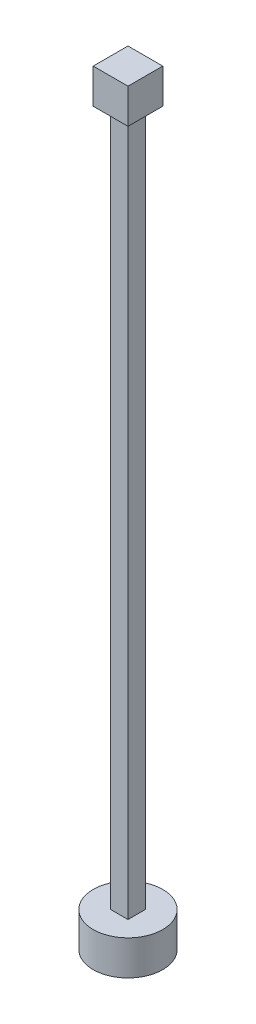
ISO-10303-21;
HEADER;
FILE_DESCRIPTION(('STEP AP214'),'2;1');
FILE_NAME('part.step','',(''),(''),'','','');
FILE_SCHEMA(('AUTOMOTIVE_DESIGN { 1 0 10303 214 1 1 1 1 }'));
ENDSEC;
DATA;
#1=APPLICATION_CONTEXT('core data for automotive mechanical design processes');
#2=APPLICATION_PROTOCOL_DEFINITION('international standard','automotive_design',2000,#1);
#3=PRODUCT_CONTEXT('',#1,'mechanical');
#4=PRODUCT('Part','Part','',(#3));
#5=PRODUCT_RELATED_PRODUCT_CATEGORY('part','',(#4));
#6=PRODUCT_DEFINITION_FORMATION('','',#4);
#7=PRODUCT_DEFINITION_CONTEXT('part definition',#1,'design');
#8=PRODUCT_DEFINITION('design','',#6,#7);
#9=PRODUCT_DEFINITION_SHAPE('','',#8);
#10=(LENGTH_UNIT() NAMED_UNIT(*) SI_UNIT(.MILLI.,.METRE.));
#11=(NAMED_UNIT(*) PLANE_ANGLE_UNIT() SI_UNIT($,.RADIAN.));
#12=(NAMED_UNIT(*) SI_UNIT($,.STERADIAN.) SOLID_ANGLE_UNIT());
#13=UNCERTAINTY_MEASURE_WITH_UNIT(LENGTH_MEASURE(1.E-05),#10,'distance_accuracy_value','');
#14=(GEOMETRIC_REPRESENTATION_CONTEXT(3) GLOBAL_UNCERTAINTY_ASSIGNED_CONTEXT((#13)) GLOBAL_UNIT_ASSIGNED_CONTEXT((#10,
#11,#12)) REPRESENTATION_CONTEXT('',''));
#15=CARTESIAN_POINT('',(0.,0.,0.));
#16=DIRECTION('',(0.,0.,1.));
#17=DIRECTION('',(1.,0.,0.));
#18=AXIS2_PLACEMENT_3D('',#15,#16,#17);
#19=CARTESIAN_POINT('',(0.,50.,0.));
#20=DIRECTION('',(0.,-1.,0.));
#21=DIRECTION('',(0.,0.,-1.));
#22=AXIS2_PLACEMENT_3D('',#19,#20,#21);
#23=CYLINDRICAL_SURFACE('',#22,50.);
#24=CARTESIAN_POINT('',(0.,50.,0.));
#25=DIRECTION('',(0.,1.,0.));
#26=DIRECTION('',(0.,0.,1.));
#27=AXIS2_PLACEMENT_3D('',#24,#25,#26);
#28=CIRCLE('',#27,50.);
#29=CARTESIAN_POINT('',(0.,50.,50.));
#30=VERTEX_POINT('',#29);
#31=EDGE_CURVE('E11',#30,#30,#28,.T.);
#32=ORIENTED_EDGE('',*,*,#31,.F.);
#33=EDGE_LOOP('',(#32));
#34=FACE_BOUND('',#33,.T.);
#35=CARTESIAN_POINT('',(0.,0.,0.));
#36=DIRECTION('',(0.,1.,0.));
#37=DIRECTION('',(0.,0.,1.));
#38=AXIS2_PLACEMENT_3D('',#35,#36,#37);
#39=CIRCLE('',#38,50.);
#40=CARTESIAN_POINT('',(0.,0.,50.));
#41=VERTEX_POINT('',#40);
#42=EDGE_CURVE('E42',#41,#41,#39,.T.);
#43=ORIENTED_EDGE('',*,*,#42,.T.);
#44=EDGE_LOOP('',(#43));
#45=FACE_BOUND('',#44,.T.);
#46=ADVANCED_FACE('F39',(#34,#45),#23,.T.);
#47=CARTESIAN_POINT('',(0.,50.,0.));
#48=DIRECTION('',(0.,1.,0.));
#49=DIRECTION('',(0.,0.,1.));
#50=AXIS2_PLACEMENT_3D('',#47,#48,#49);
#51=PLANE('',#50);
#52=DIRECTION('',(0.,0.,-1.));
#53=VECTOR('',#52,1.);
#54=CARTESIAN_POINT('',(12.5,50.,-12.5));
#55=LINE('',#54,#53);
#56=CARTESIAN_POINT('',(12.5,50.,12.5));
#57=VERTEX_POINT('',#56);
#58=CARTESIAN_POINT('',(12.5,50.,-12.5));
#59=VERTEX_POINT('',#58);
#60=EDGE_CURVE('E53',#57,#59,#55,.T.);
#61=ORIENTED_EDGE('',*,*,#60,.F.);
#62=DIRECTION('',(1.,0.,0.));
#63=VECTOR('',#62,1.);
#64=CARTESIAN_POINT('',(-12.5,50.,12.5));
#65=LINE('',#64,#63);
#66=CARTESIAN_POINT('',(-12.5,50.,12.5));
#67=VERTEX_POINT('',#66);
#68=EDGE_CURVE('E57',#67,#57,#65,.T.);
#69=ORIENTED_EDGE('',*,*,#68,.F.);
#70=DIRECTION('',(0.,0.,1.));
#71=VECTOR('',#70,1.);
#72=CARTESIAN_POINT('',(-12.5,50.,-12.5));
#73=LINE('',#72,#71);
#74=CARTESIAN_POINT('',(-12.5,50.,-12.5));
#75=VERTEX_POINT('',#74);
#76=EDGE_CURVE('E148',#75,#67,#73,.T.);
#77=ORIENTED_EDGE('',*,*,#76,.F.);
#78=DIRECTION('',(-1.,0.,0.));
#79=VECTOR('',#78,1.);
#80=CARTESIAN_POINT('',(-12.5,50.,-12.5));
#81=LINE('',#80,#79);
#82=EDGE_CURVE('E127',#59,#75,#81,.T.);
#83=ORIENTED_EDGE('',*,*,#82,.F.);
#84=EDGE_LOOP('',(#61,#69,#77,#83));
#85=FACE_BOUND('',#84,.T.);
#86=ORIENTED_EDGE('',*,*,#31,.T.);
#87=EDGE_LOOP('',(#86));
#88=FACE_BOUND('',#87,.T.);
#89=ADVANCED_FACE('F170',(#85,#88),#51,.T.);
#90=CARTESIAN_POINT('',(0.,0.,0.));
#91=DIRECTION('',(0.,1.,0.));
#92=DIRECTION('',(0.,0.,1.));
#93=AXIS2_PLACEMENT_3D('',#90,#91,#92);
#94=PLANE('',#93);
#95=ORIENTED_EDGE('',*,*,#42,.F.);
#96=EDGE_LOOP('',(#95));
#97=FACE_BOUND('',#96,.T.);
#98=ADVANCED_FACE('F167',(#97),#94,.F.);
#99=CARTESIAN_POINT('',(12.5,1050.,-12.5));
#100=DIRECTION('',(-1.,0.,0.));
#101=DIRECTION('',(0.,0.,1.));
#102=AXIS2_PLACEMENT_3D('',#99,#100,#101);
#103=PLANE('',#102);
#104=ORIENTED_EDGE('',*,*,#60,.T.);
#105=DIRECTION('',(0.,-1.,0.));
#106=VECTOR('',#105,1.);
#107=CARTESIAN_POINT('',(12.5,1050.,-12.5));
#108=LINE('',#107,#106);
#109=CARTESIAN_POINT('',(12.5,1050.,-12.5));
#110=VERTEX_POINT('',#109);
#111=EDGE_CURVE('E159',#110,#59,#108,.T.);
#112=ORIENTED_EDGE('',*,*,#111,.F.);
#113=DIRECTION('',(0.,0.,-1.));
#114=VECTOR('',#113,1.);
#115=CARTESIAN_POINT('',(12.5,1050.,-12.5));
#116=LINE('',#115,#114);
#117=CARTESIAN_POINT('',(12.5,1050.,12.5));
#118=VERTEX_POINT('',#117);
#119=EDGE_CURVE('E133',#118,#110,#116,.T.);
#120=ORIENTED_EDGE('',*,*,#119,.F.);
#121=DIRECTION('',(0.,-1.,0.));
#122=VECTOR('',#121,1.);
#123=CARTESIAN_POINT('',(12.5,1050.,12.5));
#124=LINE('',#123,#122);
#125=EDGE_CURVE('E144',#118,#57,#124,.T.);
#126=ORIENTED_EDGE('',*,*,#125,.T.);
#127=EDGE_LOOP('',(#104,#112,#120,#126));
#128=FACE_BOUND('',#127,.T.);
#129=ADVANCED_FACE('F169',(#128),#103,.F.);
#130=CARTESIAN_POINT('',(-12.5,1050.,-12.5));
#131=DIRECTION('',(0.,0.,1.));
#132=DIRECTION('',(1.,0.,0.));
#133=AXIS2_PLACEMENT_3D('',#130,#131,#132);
#134=PLANE('',#133);
#135=ORIENTED_EDGE('',*,*,#82,.T.);
#136=DIRECTION('',(0.,-1.,0.));
#137=VECTOR('',#136,1.);
#138=CARTESIAN_POINT('',(-12.5,1050.,-12.5));
#139=LINE('',#138,#137);
#140=CARTESIAN_POINT('',(-12.5,1050.,-12.5));
#141=VERTEX_POINT('',#140);
#142=EDGE_CURVE('E156',#141,#75,#139,.T.);
#143=ORIENTED_EDGE('',*,*,#142,.F.);
#144=DIRECTION('',(-1.,0.,0.));
#145=VECTOR('',#144,1.);
#146=CARTESIAN_POINT('',(-12.5,1050.,-12.5));
#147=LINE('',#146,#145);
#148=EDGE_CURVE('E136',#110,#141,#147,.T.);
#149=ORIENTED_EDGE('',*,*,#148,.F.);
#150=ORIENTED_EDGE('',*,*,#111,.T.);
#151=EDGE_LOOP('',(#135,#143,#149,#150));
#152=FACE_BOUND('',#151,.T.);
#153=ADVANCED_FACE('F176',(#152),#134,.F.);
#154=CARTESIAN_POINT('',(-12.5,1050.,-12.5));
#155=DIRECTION('',(1.,0.,0.));
#156=DIRECTION('',(0.,0.,-1.));
#157=AXIS2_PLACEMENT_3D('',#154,#155,#156);
#158=PLANE('',#157);
#159=ORIENTED_EDGE('',*,*,#76,.T.);
#160=DIRECTION('',(0.,-1.,0.));
#161=VECTOR('',#160,1.);
#162=CARTESIAN_POINT('',(-12.5,1050.,12.5));
#163=LINE('',#162,#161);
#164=CARTESIAN_POINT('',(-12.5,1050.,12.5));
#165=VERTEX_POINT('',#164);
#166=EDGE_CURVE('E153',#165,#67,#163,.T.);
#167=ORIENTED_EDGE('',*,*,#166,.F.);
#168=DIRECTION('',(0.,0.,1.));
#169=VECTOR('',#168,1.);
#170=CARTESIAN_POINT('',(-12.5,1050.,-12.5));
#171=LINE('',#170,#169);
#172=EDGE_CURVE('E139',#141,#165,#171,.T.);
#173=ORIENTED_EDGE('',*,*,#172,.F.);
#174=ORIENTED_EDGE('',*,*,#142,.T.);
#175=EDGE_LOOP('',(#159,#167,#173,#174));
#176=FACE_BOUND('',#175,.T.);
#177=ADVANCED_FACE('F211',(#176),#158,.F.);
#178=CARTESIAN_POINT('',(-12.5,1050.,12.5));
#179=DIRECTION('',(0.,0.,-1.));
#180=DIRECTION('',(-1.,0.,0.));
#181=AXIS2_PLACEMENT_3D('',#178,#179,#180);
#182=PLANE('',#181);
#183=ORIENTED_EDGE('',*,*,#68,.T.);
#184=ORIENTED_EDGE('',*,*,#125,.F.);
#185=DIRECTION('',(1.,0.,0.));
#186=VECTOR('',#185,1.);
#187=CARTESIAN_POINT('',(-12.5,1050.,12.5));
#188=LINE('',#187,#186);
#189=EDGE_CURVE('E142',#165,#118,#188,.T.);
#190=ORIENTED_EDGE('',*,*,#189,.F.);
#191=ORIENTED_EDGE('',*,*,#166,.T.);
#192=EDGE_LOOP('',(#183,#184,#190,#191));
#193=FACE_BOUND('',#192,.T.);
#194=ADVANCED_FACE('F220',(#193),#182,.F.);
#195=CARTESIAN_POINT('',(0.,1050.,0.));
#196=DIRECTION('',(0.,1.,0.));
#197=DIRECTION('',(0.,0.,1.));
#198=AXIS2_PLACEMENT_3D('',#195,#196,#197);
#199=PLANE('',#198);
#200=DIRECTION('',(0.,0.,-1.));
#201=VECTOR('',#200,1.);
#202=CARTESIAN_POINT('',(25.,1050.,-25.));
#203=LINE('',#202,#201);
#204=CARTESIAN_POINT('',(25.,1050.,25.));
#205=VERTEX_POINT('',#204);
#206=CARTESIAN_POINT('',(25.,1050.,-25.));
#207=VERTEX_POINT('',#206);
#208=EDGE_CURVE('E125',#205,#207,#203,.T.);
#209=ORIENTED_EDGE('',*,*,#208,.F.);
#210=DIRECTION('',(1.,0.,0.));
#211=VECTOR('',#210,1.);
#212=CARTESIAN_POINT('',(-25.,1050.,25.));
#213=LINE('',#212,#211);
#214=CARTESIAN_POINT('',(-25.,1050.,25.));
#215=VERTEX_POINT('',#214);
#216=EDGE_CURVE('E121',#215,#205,#213,.T.);
#217=ORIENTED_EDGE('',*,*,#216,.F.);
#218=DIRECTION('',(0.,0.,1.));
#219=VECTOR('',#218,1.);
#220=CARTESIAN_POINT('',(-25.,1050.,-25.));
#221=LINE('',#220,#219);
#222=CARTESIAN_POINT('',(-25.,1050.,-25.));
#223=VERTEX_POINT('',#222);
#224=EDGE_CURVE('E292',#223,#215,#221,.T.);
#225=ORIENTED_EDGE('',*,*,#224,.F.);
#226=DIRECTION('',(-1.,0.,0.));
#227=VECTOR('',#226,1.);
#228=CARTESIAN_POINT('',(-25.,1050.,-25.));
#229=LINE('',#228,#227);
#230=EDGE_CURVE('E296',#207,#223,#229,.T.);
#231=ORIENTED_EDGE('',*,*,#230,.F.);
#232=EDGE_LOOP('',(#209,#217,#225,#231));
#233=FACE_BOUND('',#232,.T.);
#234=ORIENTED_EDGE('',*,*,#189,.T.);
#235=ORIENTED_EDGE('',*,*,#119,.T.);
#236=ORIENTED_EDGE('',*,*,#148,.T.);
#237=ORIENTED_EDGE('',*,*,#172,.T.);
#238=EDGE_LOOP('',(#234,#235,#236,#237));
#239=FACE_BOUND('',#238,.T.);
#240=ADVANCED_FACE('F230',(#233,#239),#199,.F.);
#241=CARTESIAN_POINT('',(25.,1100.,-25.));
#242=DIRECTION('',(-1.,0.,0.));
#243=DIRECTION('',(0.,0.,1.));
#244=AXIS2_PLACEMENT_3D('',#241,#242,#243);
#245=PLANE('',#244);
#246=ORIENTED_EDGE('',*,*,#208,.T.);
#247=DIRECTION('',(0.,-1.,0.));
#248=VECTOR('',#247,1.);
#249=CARTESIAN_POINT('',(25.,1100.,-25.));
#250=LINE('',#249,#248);
#251=CARTESIAN_POINT('',(25.,1100.,-25.));
#252=VERTEX_POINT('',#251);
#253=EDGE_CURVE('E105',#252,#207,#250,.T.);
#254=ORIENTED_EDGE('',*,*,#253,.F.);
#255=DIRECTION('',(0.,0.,-1.));
#256=VECTOR('',#255,1.);
#257=CARTESIAN_POINT('',(25.,1100.,-25.));
#258=LINE('',#257,#256);
#259=CARTESIAN_POINT('',(25.,1100.,25.));
#260=VERTEX_POINT('',#259);
#261=EDGE_CURVE('E112',#260,#252,#258,.T.);
#262=ORIENTED_EDGE('',*,*,#261,.F.);
#263=DIRECTION('',(0.,-1.,0.));
#264=VECTOR('',#263,1.);
#265=CARTESIAN_POINT('',(25.,1100.,25.));
#266=LINE('',#265,#264);
#267=EDGE_CURVE('E289',#260,#205,#266,.T.);
#268=ORIENTED_EDGE('',*,*,#267,.T.);
#269=EDGE_LOOP('',(#246,#254,#262,#268));
#270=FACE_BOUND('',#269,.T.);
#271=ADVANCED_FACE('F123',(#270),#245,.F.);
#272=CARTESIAN_POINT('',(-25.,1100.,-25.));
#273=DIRECTION('',(0.,0.,1.));
#274=DIRECTION('',(1.,0.,0.));
#275=AXIS2_PLACEMENT_3D('',#272,#273,#274);
#276=PLANE('',#275);
#277=ORIENTED_EDGE('',*,*,#230,.T.);
#278=DIRECTION('',(0.,-1.,0.));
#279=VECTOR('',#278,1.);
#280=CARTESIAN_POINT('',(-25.,1100.,-25.));
#281=LINE('',#280,#279);
#282=CARTESIAN_POINT('',(-25.,1100.,-25.));
#283=VERTEX_POINT('',#282);
#284=EDGE_CURVE('E108',#283,#223,#281,.T.);
#285=ORIENTED_EDGE('',*,*,#284,.F.);
#286=DIRECTION('',(-1.,0.,0.));
#287=VECTOR('',#286,1.);
#288=CARTESIAN_POINT('',(-25.,1100.,-25.));
#289=LINE('',#288,#287);
#290=EDGE_CURVE('E101',#252,#283,#289,.T.);
#291=ORIENTED_EDGE('',*,*,#290,.F.);
#292=ORIENTED_EDGE('',*,*,#253,.T.);
#293=EDGE_LOOP('',(#277,#285,#291,#292));
#294=FACE_BOUND('',#293,.T.);
#295=ADVANCED_FACE('F103',(#294),#276,.F.);
#296=CARTESIAN_POINT('',(-25.,1100.,-25.));
#297=DIRECTION('',(1.,0.,0.));
#298=DIRECTION('',(0.,0.,-1.));
#299=AXIS2_PLACEMENT_3D('',#296,#297,#298);
#300=PLANE('',#299);
#301=ORIENTED_EDGE('',*,*,#224,.T.);
#302=DIRECTION('',(0.,-1.,0.));
#303=VECTOR('',#302,1.);
#304=CARTESIAN_POINT('',(-25.,1100.,25.));
#305=LINE('',#304,#303);
#306=CARTESIAN_POINT('',(-25.,1100.,25.));
#307=VERTEX_POINT('',#306);
#308=EDGE_CURVE('E129',#307,#215,#305,.T.);
#309=ORIENTED_EDGE('',*,*,#308,.F.);
#310=DIRECTION('',(0.,0.,1.));
#311=VECTOR('',#310,1.);
#312=CARTESIAN_POINT('',(-25.,1100.,-25.));
#313=LINE('',#312,#311);
#314=EDGE_CURVE('E111',#283,#307,#313,.T.);
#315=ORIENTED_EDGE('',*,*,#314,.F.);
#316=ORIENTED_EDGE('',*,*,#284,.T.);
#317=EDGE_LOOP('',(#301,#309,#315,#316));
#318=FACE_BOUND('',#317,.T.);
#319=ADVANCED_FACE('F257',(#318),#300,.F.);
#320=CARTESIAN_POINT('',(-25.,1100.,25.));
#321=DIRECTION('',(0.,0.,-1.));
#322=DIRECTION('',(-1.,0.,0.));
#323=AXIS2_PLACEMENT_3D('',#320,#321,#322);
#324=PLANE('',#323);
#325=ORIENTED_EDGE('',*,*,#216,.T.);
#326=ORIENTED_EDGE('',*,*,#267,.F.);
#327=DIRECTION('',(1.,0.,0.));
#328=VECTOR('',#327,1.);
#329=CARTESIAN_POINT('',(-25.,1100.,25.));
#330=LINE('',#329,#328);
#331=EDGE_CURVE('E117',#307,#260,#330,.T.);
#332=ORIENTED_EDGE('',*,*,#331,.F.);
#333=ORIENTED_EDGE('',*,*,#308,.T.);
#334=EDGE_LOOP('',(#325,#326,#332,#333));
#335=FACE_BOUND('',#334,.T.);
#336=ADVANCED_FACE('F266',(#335),#324,.F.);
#337=CARTESIAN_POINT('',(0.,1100.,0.));
#338=DIRECTION('',(0.,1.,0.));
#339=DIRECTION('',(0.,0.,1.));
#340=AXIS2_PLACEMENT_3D('',#337,#338,#339);
#341=PLANE('',#340);
#342=ORIENTED_EDGE('',*,*,#261,.T.);
#343=ORIENTED_EDGE('',*,*,#290,.T.);
#344=ORIENTED_EDGE('',*,*,#314,.T.);
#345=ORIENTED_EDGE('',*,*,#331,.T.);
#346=EDGE_LOOP('',(#342,#343,#344,#345));
#347=FACE_BOUND('',#346,.T.);
#348=ADVANCED_FACE('F115',(#347),#341,.T.);
#349=CLOSED_SHELL('',(#46,#89,#98,#129,#153,#177,#194,#240,#271,#295,#319,#336,#348));
#350=MANIFOLD_SOLID_BREP('B2',#349);
#351=ADVANCED_BREP_SHAPE_REPRESENTATION('',(#18,#350),#14);
#352=SHAPE_DEFINITION_REPRESENTATION(#9,#351);
ENDSEC;
END-ISO-10303-21;
